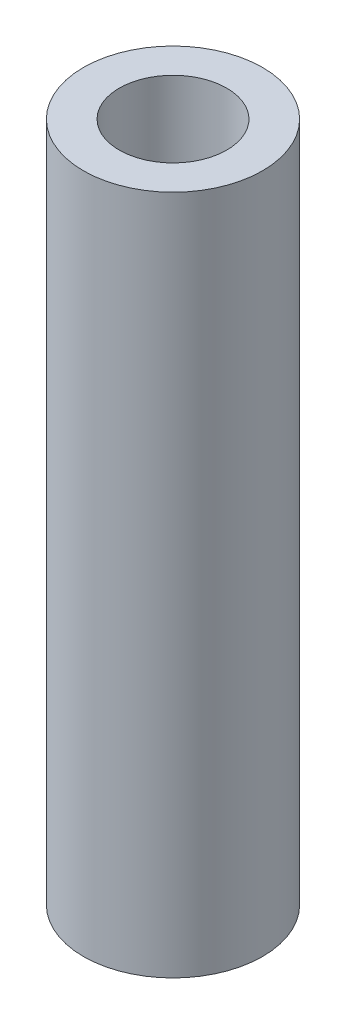
ISO-10303-21;
HEADER;
FILE_DESCRIPTION(('STEP AP214'),'2;1');
FILE_NAME('part.step','',(''),(''),'','','');
FILE_SCHEMA(('AUTOMOTIVE_DESIGN { 1 0 10303 214 1 1 1 1 }'));
ENDSEC;
DATA;
#1=APPLICATION_CONTEXT('core data for automotive mechanical design processes');
#2=APPLICATION_PROTOCOL_DEFINITION('international standard','automotive_design',2000,#1);
#3=PRODUCT_CONTEXT('',#1,'mechanical');
#4=PRODUCT('Part','Part','',(#3));
#5=PRODUCT_RELATED_PRODUCT_CATEGORY('part','',(#4));
#6=PRODUCT_DEFINITION_FORMATION('','',#4);
#7=PRODUCT_DEFINITION_CONTEXT('part definition',#1,'design');
#8=PRODUCT_DEFINITION('design','',#6,#7);
#9=PRODUCT_DEFINITION_SHAPE('','',#8);
#10=(LENGTH_UNIT() NAMED_UNIT(*) SI_UNIT(.MILLI.,.METRE.));
#11=(NAMED_UNIT(*) PLANE_ANGLE_UNIT() SI_UNIT($,.RADIAN.));
#12=(NAMED_UNIT(*) SI_UNIT($,.STERADIAN.) SOLID_ANGLE_UNIT());
#13=UNCERTAINTY_MEASURE_WITH_UNIT(LENGTH_MEASURE(1.E-05),#10,'distance_accuracy_value','');
#14=(GEOMETRIC_REPRESENTATION_CONTEXT(3) GLOBAL_UNCERTAINTY_ASSIGNED_CONTEXT((#13)) GLOBAL_UNIT_ASSIGNED_CONTEXT((#10,
#11,#12)) REPRESENTATION_CONTEXT('',''));
#15=CARTESIAN_POINT('',(0.,0.,0.));
#16=DIRECTION('',(0.,0.,1.));
#17=DIRECTION('',(1.,0.,0.));
#18=AXIS2_PLACEMENT_3D('',#15,#16,#17);
#19=CARTESIAN_POINT('',(0.,48.26,0.));
#20=DIRECTION('',(0.,1.,0.));
#21=DIRECTION('',(0.,0.,1.));
#22=AXIS2_PLACEMENT_3D('',#19,#20,#21);
#23=PLANE('',#22);
#24=CARTESIAN_POINT('',(0.,48.26,0.));
#25=DIRECTION('',(0.,1.,0.));
#26=DIRECTION('',(0.,0.,1.));
#27=AXIS2_PLACEMENT_3D('',#24,#25,#26);
#28=CIRCLE('',#27,6.35);
#29=CARTESIAN_POINT('',(0.,48.26,-6.35));
#30=VERTEX_POINT('',#29);
#31=EDGE_CURVE('E10',#30,#30,#28,.T.);
#32=ORIENTED_EDGE('',*,*,#31,.T.);
#33=EDGE_LOOP('',(#32));
#34=FACE_BOUND('',#33,.T.);
#35=CARTESIAN_POINT('',(0.,48.26,0.));
#36=DIRECTION('',(0.,1.,0.));
#37=DIRECTION('',(0.,0.,1.));
#38=AXIS2_PLACEMENT_3D('',#35,#36,#37);
#39=CIRCLE('',#38,3.81);
#40=CARTESIAN_POINT('',(0.,48.26,-3.81));
#41=VERTEX_POINT('',#40);
#42=EDGE_CURVE('E54',#41,#41,#39,.T.);
#43=ORIENTED_EDGE('',*,*,#42,.F.);
#44=EDGE_LOOP('',(#43));
#45=FACE_BOUND('',#44,.T.);
#46=ADVANCED_FACE('F41',(#34,#45),#23,.T.);
#47=CARTESIAN_POINT('',(0.,0.,0.));
#48=DIRECTION('',(0.,1.,0.));
#49=DIRECTION('',(0.,0.,1.));
#50=AXIS2_PLACEMENT_3D('',#47,#48,#49);
#51=PLANE('',#50);
#52=CARTESIAN_POINT('',(0.,0.,0.));
#53=DIRECTION('',(0.,1.,0.));
#54=DIRECTION('',(0.,0.,1.));
#55=AXIS2_PLACEMENT_3D('',#52,#53,#54);
#56=CIRCLE('',#55,6.35);
#57=CARTESIAN_POINT('',(0.,0.,-6.35));
#58=VERTEX_POINT('',#57);
#59=EDGE_CURVE('E45',#58,#58,#56,.T.);
#60=ORIENTED_EDGE('',*,*,#59,.F.);
#61=EDGE_LOOP('',(#60));
#62=FACE_BOUND('',#61,.T.);
#63=CARTESIAN_POINT('',(0.,0.,0.));
#64=DIRECTION('',(0.,1.,0.));
#65=DIRECTION('',(0.,0.,1.));
#66=AXIS2_PLACEMENT_3D('',#63,#64,#65);
#67=CIRCLE('',#66,3.81);
#68=CARTESIAN_POINT('',(0.,0.,-3.81));
#69=VERTEX_POINT('',#68);
#70=EDGE_CURVE('E56',#69,#69,#67,.T.);
#71=ORIENTED_EDGE('',*,*,#70,.T.);
#72=EDGE_LOOP('',(#71));
#73=FACE_BOUND('',#72,.T.);
#74=ADVANCED_FACE('F68',(#62,#73),#51,.F.);
#75=CARTESIAN_POINT('',(0.,48.26,0.));
#76=DIRECTION('',(0.,-1.,0.));
#77=DIRECTION('',(0.,0.,-1.));
#78=AXIS2_PLACEMENT_3D('',#75,#76,#77);
#79=CYLINDRICAL_SURFACE('',#78,6.35);
#80=CARTESIAN_POINT('',(0.,48.26,-6.35));
#81=CARTESIAN_POINT('',(0.,47.7572916666667,-6.35));
#82=CARTESIAN_POINT('',(0.,47.2545833333333,-6.35));
#83=CARTESIAN_POINT('',(0.,46.2491666666667,-6.35));
#84=CARTESIAN_POINT('',(0.,45.7464583333333,-6.35));
#85=CARTESIAN_POINT('',(0.,44.7410416666667,-6.35));
#86=CARTESIAN_POINT('',(0.,44.2383333333333,-6.35));
#87=CARTESIAN_POINT('',(0.,43.2329166666667,-6.35));
#88=CARTESIAN_POINT('',(0.,42.7302083333333,-6.35));
#89=CARTESIAN_POINT('',(0.,41.7247916666667,-6.35));
#90=CARTESIAN_POINT('',(0.,41.2220833333333,-6.35));
#91=CARTESIAN_POINT('',(0.,40.2166666666667,-6.35));
#92=CARTESIAN_POINT('',(0.,39.7139583333333,-6.35));
#93=CARTESIAN_POINT('',(0.,38.7085416666667,-6.35));
#94=CARTESIAN_POINT('',(0.,38.2058333333333,-6.35));
#95=CARTESIAN_POINT('',(0.,37.2004166666667,-6.35));
#96=CARTESIAN_POINT('',(0.,36.6977083333333,-6.35));
#97=CARTESIAN_POINT('',(0.,35.6922916666667,-6.35));
#98=CARTESIAN_POINT('',(0.,35.1895833333333,-6.35));
#99=CARTESIAN_POINT('',(0.,34.1841666666667,-6.35));
#100=CARTESIAN_POINT('',(0.,33.6814583333333,-6.35));
#101=CARTESIAN_POINT('',(0.,32.6760416666667,-6.35));
#102=CARTESIAN_POINT('',(0.,32.1733333333333,-6.35));
#103=CARTESIAN_POINT('',(0.,31.1679166666667,-6.35));
#104=CARTESIAN_POINT('',(0.,30.6652083333333,-6.35));
#105=CARTESIAN_POINT('',(0.,29.6597916666667,-6.35));
#106=CARTESIAN_POINT('',(0.,29.1570833333333,-6.35));
#107=CARTESIAN_POINT('',(0.,28.1516666666667,-6.35));
#108=CARTESIAN_POINT('',(0.,27.6489583333333,-6.35));
#109=CARTESIAN_POINT('',(0.,26.6435416666667,-6.35));
#110=CARTESIAN_POINT('',(0.,26.1408333333333,-6.35));
#111=CARTESIAN_POINT('',(0.,25.1354166666667,-6.35));
#112=CARTESIAN_POINT('',(0.,24.6327083333333,-6.35));
#113=CARTESIAN_POINT('',(0.,23.6272916666667,-6.35));
#114=CARTESIAN_POINT('',(0.,23.1245833333333,-6.35));
#115=CARTESIAN_POINT('',(0.,22.1191666666667,-6.35));
#116=CARTESIAN_POINT('',(0.,21.6164583333333,-6.35));
#117=CARTESIAN_POINT('',(0.,20.6110416666667,-6.35));
#118=CARTESIAN_POINT('',(0.,20.1083333333333,-6.35));
#119=CARTESIAN_POINT('',(0.,19.1029166666667,-6.35));
#120=CARTESIAN_POINT('',(0.,18.6002083333333,-6.35));
#121=CARTESIAN_POINT('',(0.,17.5947916666667,-6.35));
#122=CARTESIAN_POINT('',(0.,17.0920833333333,-6.35));
#123=CARTESIAN_POINT('',(0.,16.0866666666667,-6.35));
#124=CARTESIAN_POINT('',(0.,15.5839583333333,-6.35));
#125=CARTESIAN_POINT('',(0.,14.5785416666667,-6.35));
#126=CARTESIAN_POINT('',(0.,14.0758333333333,-6.35));
#127=CARTESIAN_POINT('',(0.,13.0704166666667,-6.35));
#128=CARTESIAN_POINT('',(0.,12.5677083333333,-6.35));
#129=CARTESIAN_POINT('',(0.,11.5622916666667,-6.35));
#130=CARTESIAN_POINT('',(0.,11.0595833333333,-6.35));
#131=CARTESIAN_POINT('',(0.,10.0541666666667,-6.35));
#132=CARTESIAN_POINT('',(0.,9.55145833333333,-6.35));
#133=CARTESIAN_POINT('',(0.,8.54604166666666,-6.35));
#134=CARTESIAN_POINT('',(0.,8.04333333333333,-6.35));
#135=CARTESIAN_POINT('',(0.,7.03791666666666,-6.35));
#136=CARTESIAN_POINT('',(0.,6.53520833333333,-6.35));
#137=CARTESIAN_POINT('',(0.,5.52979166666666,-6.35));
#138=CARTESIAN_POINT('',(0.,5.02708333333333,-6.35));
#139=CARTESIAN_POINT('',(0.,4.02166666666666,-6.35));
#140=CARTESIAN_POINT('',(0.,3.51895833333332,-6.35));
#141=CARTESIAN_POINT('',(0.,2.51354166666666,-6.35));
#142=CARTESIAN_POINT('',(0.,2.01083333333333,-6.35));
#143=CARTESIAN_POINT('',(0.,1.00541666666666,-6.35));
#144=CARTESIAN_POINT('',(0.,0.502708333333326,-6.35));
#145=CARTESIAN_POINT('',(0.,0.,-6.35));
#146=B_SPLINE_CURVE_WITH_KNOTS('',3,(#80,#81,#82,#83,#84,#85,#86,#87,#88,#89,#90,#91,#92,#93,
#94,#95,#96,#97,#98,#99,#100,#101,#102,#103,#104,#105,#106,#107,#108,#109,#110,#111,#112,#113,
#114,#115,#116,#117,#118,#119,#120,#121,#122,#123,#124,#125,#126,#127,#128,#129,#130,#131,#132,
#133,#134,#135,#136,#137,#138,#139,#140,#141,#142,#143,#144,#145),.UNSPECIFIED.,.F.,.F.,(4,2,2,
2,2,2,2,2,2,2,2,2,2,2,2,2,2,2,2,2,2,2,2,2,2,2,2,2,2,2,2,2,4),(0.,1.508125,3.01625,4.524375,
6.0325,7.540625,9.04874999999999,10.556875,12.065,13.573125,15.08125,16.589375,18.0975,
19.605625,21.11375,22.621875,24.13,25.638125,27.14625,28.654375,30.1625,31.670625,33.17875,
34.686875,36.195,37.703125,39.21125,40.719375,42.2275,43.735625,45.24375,46.751875,48.26),.UNSPECIFIED.);
#147=EDGE_CURVE('BSEAM43',#30,#58,#146,.T.);
#148=ORIENTED_EDGE('',*,*,#31,.F.);
#149=ORIENTED_EDGE('',*,*,#59,.T.);
#150=ORIENTED_EDGE('',*,*,#147,.T.);
#151=ORIENTED_EDGE('',*,*,#147,.F.);
#152=EDGE_LOOP('',(#148,#150,#149,#151));
#153=FACE_BOUND('',#152,.T.);
#154=ADVANCED_FACE('F43',(#153),#79,.T.);
#155=CARTESIAN_POINT('',(0.,48.26,0.));
#156=DIRECTION('',(0.,-1.,0.));
#157=DIRECTION('',(0.,0.,-1.));
#158=AXIS2_PLACEMENT_3D('',#155,#156,#157);
#159=CYLINDRICAL_SURFACE('',#158,3.81);
#160=CARTESIAN_POINT('',(0.,48.26,-3.81));
#161=CARTESIAN_POINT('',(0.,47.7572916666667,-3.81));
#162=CARTESIAN_POINT('',(0.,47.2545833333333,-3.81));
#163=CARTESIAN_POINT('',(0.,46.2491666666667,-3.81));
#164=CARTESIAN_POINT('',(0.,45.7464583333333,-3.81));
#165=CARTESIAN_POINT('',(0.,44.7410416666667,-3.81));
#166=CARTESIAN_POINT('',(0.,44.2383333333333,-3.81));
#167=CARTESIAN_POINT('',(0.,43.2329166666667,-3.81));
#168=CARTESIAN_POINT('',(0.,42.7302083333333,-3.81));
#169=CARTESIAN_POINT('',(0.,41.7247916666667,-3.81));
#170=CARTESIAN_POINT('',(0.,41.2220833333333,-3.81));
#171=CARTESIAN_POINT('',(0.,40.2166666666667,-3.81));
#172=CARTESIAN_POINT('',(0.,39.7139583333333,-3.81));
#173=CARTESIAN_POINT('',(0.,38.7085416666667,-3.81));
#174=CARTESIAN_POINT('',(0.,38.2058333333333,-3.81));
#175=CARTESIAN_POINT('',(0.,37.2004166666667,-3.81));
#176=CARTESIAN_POINT('',(0.,36.6977083333333,-3.81));
#177=CARTESIAN_POINT('',(0.,35.6922916666667,-3.81));
#178=CARTESIAN_POINT('',(0.,35.1895833333333,-3.81));
#179=CARTESIAN_POINT('',(0.,34.1841666666667,-3.81));
#180=CARTESIAN_POINT('',(0.,33.6814583333333,-3.81));
#181=CARTESIAN_POINT('',(0.,32.6760416666667,-3.81));
#182=CARTESIAN_POINT('',(0.,32.1733333333333,-3.81));
#183=CARTESIAN_POINT('',(0.,31.1679166666667,-3.81));
#184=CARTESIAN_POINT('',(0.,30.6652083333333,-3.81));
#185=CARTESIAN_POINT('',(0.,29.6597916666667,-3.81));
#186=CARTESIAN_POINT('',(0.,29.1570833333333,-3.81));
#187=CARTESIAN_POINT('',(0.,28.1516666666667,-3.81));
#188=CARTESIAN_POINT('',(0.,27.6489583333333,-3.81));
#189=CARTESIAN_POINT('',(0.,26.6435416666667,-3.81));
#190=CARTESIAN_POINT('',(0.,26.1408333333333,-3.81));
#191=CARTESIAN_POINT('',(0.,25.1354166666667,-3.81));
#192=CARTESIAN_POINT('',(0.,24.6327083333333,-3.81));
#193=CARTESIAN_POINT('',(0.,23.6272916666667,-3.81));
#194=CARTESIAN_POINT('',(0.,23.1245833333333,-3.81));
#195=CARTESIAN_POINT('',(0.,22.1191666666667,-3.81));
#196=CARTESIAN_POINT('',(0.,21.6164583333333,-3.81));
#197=CARTESIAN_POINT('',(0.,20.6110416666667,-3.81));
#198=CARTESIAN_POINT('',(0.,20.1083333333333,-3.81));
#199=CARTESIAN_POINT('',(0.,19.1029166666667,-3.81));
#200=CARTESIAN_POINT('',(0.,18.6002083333333,-3.81));
#201=CARTESIAN_POINT('',(0.,17.5947916666667,-3.81));
#202=CARTESIAN_POINT('',(0.,17.0920833333333,-3.81));
#203=CARTESIAN_POINT('',(0.,16.0866666666667,-3.81));
#204=CARTESIAN_POINT('',(0.,15.5839583333333,-3.81));
#205=CARTESIAN_POINT('',(0.,14.5785416666667,-3.81));
#206=CARTESIAN_POINT('',(0.,14.0758333333333,-3.81));
#207=CARTESIAN_POINT('',(0.,13.0704166666667,-3.81));
#208=CARTESIAN_POINT('',(0.,12.5677083333333,-3.81));
#209=CARTESIAN_POINT('',(0.,11.5622916666667,-3.81));
#210=CARTESIAN_POINT('',(0.,11.0595833333333,-3.81));
#211=CARTESIAN_POINT('',(0.,10.0541666666667,-3.81));
#212=CARTESIAN_POINT('',(0.,9.55145833333333,-3.81));
#213=CARTESIAN_POINT('',(0.,8.54604166666666,-3.81));
#214=CARTESIAN_POINT('',(0.,8.04333333333333,-3.81));
#215=CARTESIAN_POINT('',(0.,7.03791666666666,-3.81));
#216=CARTESIAN_POINT('',(0.,6.53520833333333,-3.81));
#217=CARTESIAN_POINT('',(0.,5.52979166666666,-3.81));
#218=CARTESIAN_POINT('',(0.,5.02708333333333,-3.81));
#219=CARTESIAN_POINT('',(0.,4.02166666666666,-3.81));
#220=CARTESIAN_POINT('',(0.,3.51895833333333,-3.81));
#221=CARTESIAN_POINT('',(0.,2.51354166666666,-3.81));
#222=CARTESIAN_POINT('',(0.,2.01083333333333,-3.81));
#223=CARTESIAN_POINT('',(0.,1.00541666666666,-3.81));
#224=CARTESIAN_POINT('',(0.,0.502708333333326,-3.81));
#225=CARTESIAN_POINT('',(0.,0.,-3.81));
#226=B_SPLINE_CURVE_WITH_KNOTS('',3,(#160,#161,#162,#163,#164,#165,#166,#167,#168,#169,#170,
#171,#172,#173,#174,#175,#176,#177,#178,#179,#180,#181,#182,#183,#184,#185,#186,#187,#188,#189,
#190,#191,#192,#193,#194,#195,#196,#197,#198,#199,#200,#201,#202,#203,#204,#205,#206,#207,#208,
#209,#210,#211,#212,#213,#214,#215,#216,#217,#218,#219,#220,#221,#222,#223,#224,#225),
.UNSPECIFIED.,.F.,.F.,(4,2,2,2,2,2,2,2,2,2,2,2,2,2,2,2,2,2,2,2,2,2,2,2,2,2,2,2,2,2,2,2,4),(0.,
1.50812500000001,3.01625000000001,4.524375,6.0325,7.540625,9.04875,10.556875,12.065,13.573125,
15.08125,16.589375,18.0975,19.605625,21.11375,22.621875,24.13,25.638125,27.14625,28.654375,
30.1625,31.670625,33.17875,34.686875,36.195,37.703125,39.21125,40.719375,42.2275,43.735625,
45.24375,46.751875,48.26),.UNSPECIFIED.);
#227=EDGE_CURVE('BSEAM64',#41,#69,#226,.T.);
#228=ORIENTED_EDGE('',*,*,#42,.T.);
#229=ORIENTED_EDGE('',*,*,#70,.F.);
#230=ORIENTED_EDGE('',*,*,#227,.T.);
#231=ORIENTED_EDGE('',*,*,#227,.F.);
#232=EDGE_LOOP('',(#228,#230,#229,#231));
#233=FACE_BOUND('',#232,.T.);
#234=ADVANCED_FACE('F64',(#233),#159,.F.);
#235=CLOSED_SHELL('',(#46,#74,#154,#234));
#236=MANIFOLD_SOLID_BREP('B2',#235);
#237=ADVANCED_BREP_SHAPE_REPRESENTATION('',(#18,#236),#14);
#238=SHAPE_DEFINITION_REPRESENTATION(#9,#237);
ENDSEC;
END-ISO-10303-21;
